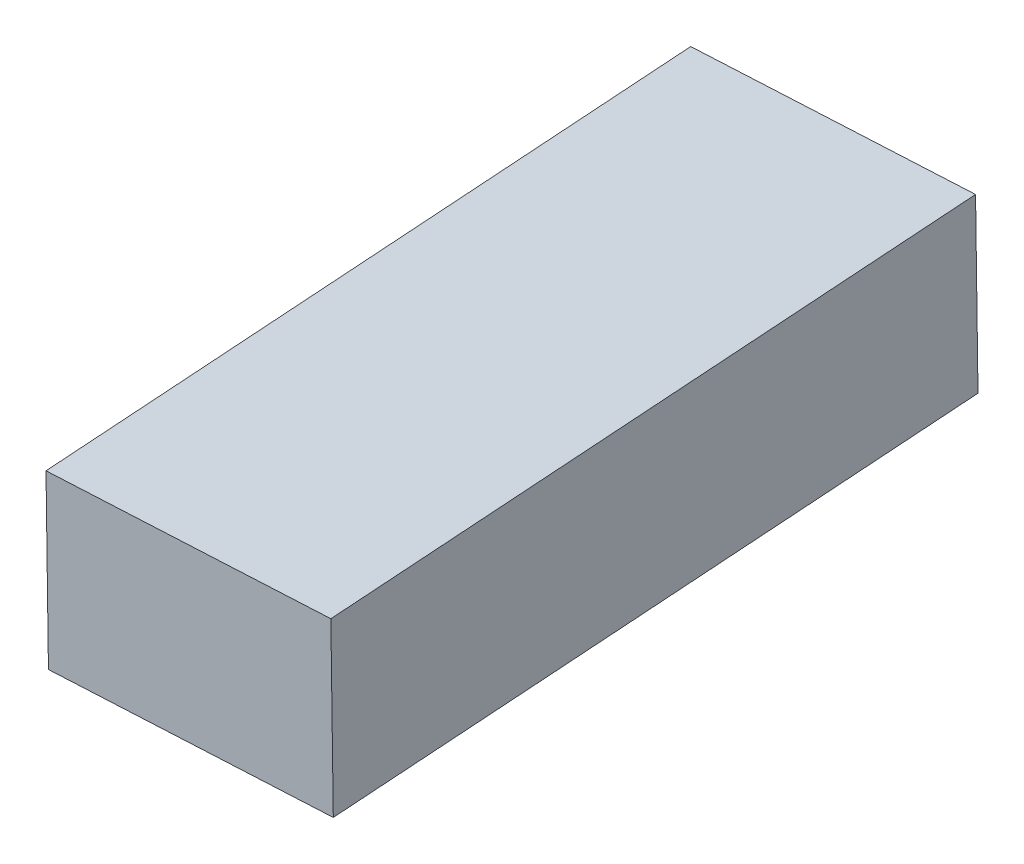
ISO-10303-21;
HEADER;
FILE_DESCRIPTION(('STEP AP214'),'2;1');
FILE_NAME('part.step','',(''),(''),'','','');
FILE_SCHEMA(('AUTOMOTIVE_DESIGN { 1 0 10303 214 1 1 1 1 }'));
ENDSEC;
DATA;
#1=APPLICATION_CONTEXT('core data for automotive mechanical design processes');
#2=APPLICATION_PROTOCOL_DEFINITION('international standard','automotive_design',2000,#1);
#3=PRODUCT_CONTEXT('',#1,'mechanical');
#4=PRODUCT('Part','Part','',(#3));
#5=PRODUCT_RELATED_PRODUCT_CATEGORY('part','',(#4));
#6=PRODUCT_DEFINITION_FORMATION('','',#4);
#7=PRODUCT_DEFINITION_CONTEXT('part definition',#1,'design');
#8=PRODUCT_DEFINITION('design','',#6,#7);
#9=PRODUCT_DEFINITION_SHAPE('','',#8);
#10=(LENGTH_UNIT() NAMED_UNIT(*) SI_UNIT(.MILLI.,.METRE.));
#11=(NAMED_UNIT(*) PLANE_ANGLE_UNIT() SI_UNIT($,.RADIAN.));
#12=(NAMED_UNIT(*) SI_UNIT($,.STERADIAN.) SOLID_ANGLE_UNIT());
#13=UNCERTAINTY_MEASURE_WITH_UNIT(LENGTH_MEASURE(1.E-05),#10,'distance_accuracy_value','');
#14=(GEOMETRIC_REPRESENTATION_CONTEXT(3) GLOBAL_UNCERTAINTY_ASSIGNED_CONTEXT((#13)) GLOBAL_UNIT_ASSIGNED_CONTEXT((#10,
#11,#12)) REPRESENTATION_CONTEXT('',''));
#15=CARTESIAN_POINT('',(0.,0.,0.));
#16=DIRECTION('',(0.,0.,1.));
#17=DIRECTION('',(1.,0.,0.));
#18=AXIS2_PLACEMENT_3D('',#15,#16,#17);
#19=CARTESIAN_POINT('',(227.521237611722,-33.589619412006,-221.411033390017));
#20=DIRECTION('',(0.998642858117833,0.000734282675102969,-0.052075932629176));
#21=DIRECTION('',(0.,0.999900606564641,0.0140988294430232));
#22=AXIS2_PLACEMENT_3D('',#19,#20,#21);
#23=PLANE('',#22);
#24=DIRECTION('',(0.,-0.999900606564641,-0.0140988294430232));
#25=VECTOR('',#24,1.);
#26=CARTESIAN_POINT('',(202.054049663003,-26.7047766520672,-709.689757491598));
#27=LINE('',#26,#25);
#28=CARTESIAN_POINT('',(202.054049663003,97.7361158578554,-707.935112172137));
#29=VERTEX_POINT('',#28);
#30=CARTESIAN_POINT('',(202.054049663003,-151.14566916199,-711.444402811059));
#31=VERTEX_POINT('',#30);
#32=EDGE_CURVE('E10',#29,#31,#27,.T.);
#33=ORIENTED_EDGE('',*,*,#32,.F.);
#34=DIRECTION('',(-0.0520811091495316,0.0140796953310961,-0.998543599573468));
#35=VECTOR('',#34,1.);
#36=CARTESIAN_POINT('',(227.521237611722,90.8512730979167,-219.656388070556));
#37=LINE('',#36,#35);
#38=CARTESIAN_POINT('',(252.988425560442,83.9664303379779,268.622336031024));
#39=VERTEX_POINT('',#38);
#40=EDGE_CURVE('E60',#39,#29,#37,.T.);
#41=ORIENTED_EDGE('',*,*,#40,.F.);
#42=DIRECTION('',(0.,0.999900606564641,0.0140988294430232));
#43=VECTOR('',#42,1.);
#44=CARTESIAN_POINT('',(252.988425560442,-40.4744621719448,266.867690711563));
#45=LINE('',#44,#43);
#46=CARTESIAN_POINT('',(252.988425560442,-164.915354681867,265.113045392102));
#47=VERTEX_POINT('',#46);
#48=EDGE_CURVE('E86',#47,#39,#45,.T.);
#49=ORIENTED_EDGE('',*,*,#48,.F.);
#50=DIRECTION('',(0.0520811091495316,-0.0140796953310961,0.998543599573468));
#51=VECTOR('',#50,1.);
#52=CARTESIAN_POINT('',(227.521237611722,-158.030511921929,-223.165678709478));
#53=LINE('',#52,#51);
#54=EDGE_CURVE('E23',#31,#47,#53,.T.);
#55=ORIENTED_EDGE('',*,*,#54,.F.);
#56=EDGE_LOOP('',(#33,#41,#49,#55));
#57=FACE_BOUND('',#56,.T.);
#58=ADVANCED_FACE('F16',(#57),#23,.T.);
#59=CARTESIAN_POINT('',(-186.649067054782,-26.9905824955119,-689.420171468526));
#60=DIRECTION('',(-0.0520811091495316,0.0140796953310961,-0.998543599573468));
#61=DIRECTION('',(-0.998642858117833,-0.000734282675102969,0.052075932629176));
#62=AXIS2_PLACEMENT_3D('',#59,#60,#61);
#63=PLANE('',#62);
#64=DIRECTION('',(0.998642858117833,0.000734282675102969,-0.052075932629176));
#65=VECTOR('',#64,1.);
#66=CARTESIAN_POINT('',(-186.649067054782,97.4503100144107,-687.665526149064));
#67=LINE('',#66,#65);
#68=CARTESIAN_POINT('',(-186.649067054782,97.4503100144107,-687.665526149064));
#69=VERTEX_POINT('',#68);
#70=EDGE_CURVE('E53',#69,#29,#67,.T.);
#71=ORIENTED_EDGE('',*,*,#70,.T.);
#72=ORIENTED_EDGE('',*,*,#32,.T.);
#73=DIRECTION('',(0.998642858117833,0.000734282675102969,-0.052075932629176));
#74=VECTOR('',#73,1.);
#75=CARTESIAN_POINT('',(-186.649067054782,-151.431475005435,-691.174816787987));
#76=LINE('',#75,#74);
#77=CARTESIAN_POINT('',(-186.649067054782,-151.431475005435,-691.174816787987));
#78=VERTEX_POINT('',#77);
#79=EDGE_CURVE('E66',#78,#31,#76,.T.);
#80=ORIENTED_EDGE('',*,*,#79,.F.);
#81=DIRECTION('',(0.,0.999900606564641,0.0140988294430232));
#82=VECTOR('',#81,1.);
#83=CARTESIAN_POINT('',(-186.649067054782,-26.9905824955119,-689.420171468526));
#84=LINE('',#83,#82);
#85=EDGE_CURVE('E64',#78,#69,#84,.T.);
#86=ORIENTED_EDGE('',*,*,#85,.T.);
#87=EDGE_LOOP('',(#71,#72,#80,#86));
#88=FACE_BOUND('',#87,.T.);
#89=ADVANCED_FACE('F65',(#88),#63,.T.);
#90=CARTESIAN_POINT('',(-161.181879106062,-158.316317765373,-202.896092686406));
#91=DIRECTION('',(0.,-0.999900606564641,-0.0140988294430232));
#92=DIRECTION('',(0.998642858117833,0.000734282675102969,-0.052075932629176));
#93=AXIS2_PLACEMENT_3D('',#90,#91,#92);
#94=PLANE('',#93);
#95=ORIENTED_EDGE('',*,*,#79,.T.);
#96=ORIENTED_EDGE('',*,*,#54,.T.);
#97=DIRECTION('',(0.998642858117833,0.000734282675102969,-0.052075932629176));
#98=VECTOR('',#97,1.);
#99=CARTESIAN_POINT('',(-135.714691157343,-165.201160525312,285.382631415174));
#100=LINE('',#99,#98);
#101=CARTESIAN_POINT('',(-135.714691157343,-165.201160525312,285.382631415174));
#102=VERTEX_POINT('',#101);
#103=EDGE_CURVE('E81',#102,#47,#100,.T.);
#104=ORIENTED_EDGE('',*,*,#103,.F.);
#105=DIRECTION('',(-0.0520811091495316,0.0140796953310961,-0.998543599573468));
#106=VECTOR('',#105,1.);
#107=CARTESIAN_POINT('',(-161.181879106062,-158.316317765373,-202.896092686406));
#108=LINE('',#107,#106);
#109=EDGE_CURVE('E70',#102,#78,#108,.T.);
#110=ORIENTED_EDGE('',*,*,#109,.T.);
#111=EDGE_LOOP('',(#95,#96,#104,#110));
#112=FACE_BOUND('',#111,.T.);
#113=ADVANCED_FACE('F90',(#112),#94,.T.);
#114=CARTESIAN_POINT('',(-135.714691157343,-40.7602680153895,287.137276734636));
#115=DIRECTION('',(0.0520811091495316,-0.0140796953310961,0.998543599573468));
#116=DIRECTION('',(0.998642858117833,0.000734282675102969,-0.052075932629176));
#117=AXIS2_PLACEMENT_3D('',#114,#115,#116);
#118=PLANE('',#117);
#119=ORIENTED_EDGE('',*,*,#103,.T.);
#120=ORIENTED_EDGE('',*,*,#48,.T.);
#121=DIRECTION('',(0.998642858117833,0.000734282675102969,-0.052075932629176));
#122=VECTOR('',#121,1.);
#123=CARTESIAN_POINT('',(-135.714691157343,83.6806244945332,288.891922054097));
#124=LINE('',#123,#122);
#125=CARTESIAN_POINT('',(-135.714691157343,83.6806244945332,288.891922054097));
#126=VERTEX_POINT('',#125);
#127=EDGE_CURVE('E61',#126,#39,#124,.T.);
#128=ORIENTED_EDGE('',*,*,#127,.F.);
#129=DIRECTION('',(0.,-0.999900606564641,-0.0140988294430232));
#130=VECTOR('',#129,1.);
#131=CARTESIAN_POINT('',(-135.714691157343,-40.7602680153895,287.137276734636));
#132=LINE('',#131,#130);
#133=EDGE_CURVE('E75',#126,#102,#132,.T.);
#134=ORIENTED_EDGE('',*,*,#133,.T.);
#135=EDGE_LOOP('',(#119,#120,#128,#134));
#136=FACE_BOUND('',#135,.T.);
#137=ADVANCED_FACE('F88',(#136),#118,.T.);
#138=CARTESIAN_POINT('',(-161.181879106062,-33.8754252554507,-201.141447366945));
#139=DIRECTION('',(-0.998642858117833,-0.000734282675102969,0.052075932629176));
#140=DIRECTION('',(0.,-0.999900606564641,-0.0140988294430232));
#141=AXIS2_PLACEMENT_3D('',#138,#139,#140);
#142=PLANE('',#141);
#143=DIRECTION('',(0.0520811091495316,-0.0140796953310961,0.998543599573468));
#144=VECTOR('',#143,1.);
#145=CARTESIAN_POINT('',(-161.181879106062,90.565467254472,-199.386802047484));
#146=LINE('',#145,#144);
#147=EDGE_CURVE('E58',#69,#126,#146,.T.);
#148=ORIENTED_EDGE('',*,*,#147,.F.);
#149=ORIENTED_EDGE('',*,*,#85,.F.);
#150=ORIENTED_EDGE('',*,*,#109,.F.);
#151=ORIENTED_EDGE('',*,*,#133,.F.);
#152=EDGE_LOOP('',(#148,#149,#150,#151));
#153=FACE_BOUND('',#152,.T.);
#154=ADVANCED_FACE('F73',(#153),#142,.T.);
#155=CARTESIAN_POINT('',(-161.181879106062,90.565467254472,-199.386802047484));
#156=DIRECTION('',(0.,0.999900606564641,0.0140988294430232));
#157=DIRECTION('',(-0.998642858117833,-0.000734282675102969,0.052075932629176));
#158=AXIS2_PLACEMENT_3D('',#155,#156,#157);
#159=PLANE('',#158);
#160=ORIENTED_EDGE('',*,*,#147,.T.);
#161=ORIENTED_EDGE('',*,*,#127,.T.);
#162=ORIENTED_EDGE('',*,*,#40,.T.);
#163=ORIENTED_EDGE('',*,*,#70,.F.);
#164=EDGE_LOOP('',(#160,#161,#162,#163));
#165=FACE_BOUND('',#164,.T.);
#166=ADVANCED_FACE('F55',(#165),#159,.T.);
#167=CLOSED_SHELL('',(#58,#89,#113,#137,#154,#166));
#168=MANIFOLD_SOLID_BREP('B1',#167);
#169=ADVANCED_BREP_SHAPE_REPRESENTATION('',(#18,#168),#14);
#170=SHAPE_DEFINITION_REPRESENTATION(#9,#169);
ENDSEC;
END-ISO-10303-21;
